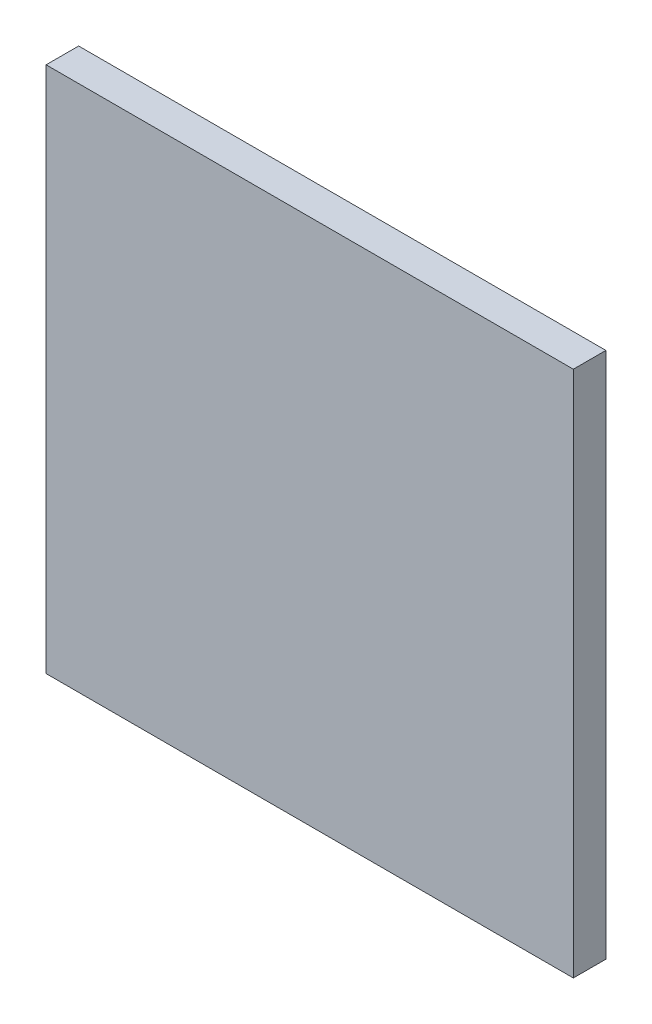
ISO-10303-21;
HEADER;
FILE_DESCRIPTION(('STEP AP214'),'2;1');
FILE_NAME('part.step','',(''),(''),'','','');
FILE_SCHEMA(('AUTOMOTIVE_DESIGN { 1 0 10303 214 1 1 1 1 }'));
ENDSEC;
DATA;
#1=APPLICATION_CONTEXT('core data for automotive mechanical design processes');
#2=APPLICATION_PROTOCOL_DEFINITION('international standard','automotive_design',2000,#1);
#3=PRODUCT_CONTEXT('',#1,'mechanical');
#4=PRODUCT('Part','Part','',(#3));
#5=PRODUCT_RELATED_PRODUCT_CATEGORY('part','',(#4));
#6=PRODUCT_DEFINITION_FORMATION('','',#4);
#7=PRODUCT_DEFINITION_CONTEXT('part definition',#1,'design');
#8=PRODUCT_DEFINITION('design','',#6,#7);
#9=PRODUCT_DEFINITION_SHAPE('','',#8);
#10=(LENGTH_UNIT() NAMED_UNIT(*) SI_UNIT(.MILLI.,.METRE.));
#11=(NAMED_UNIT(*) PLANE_ANGLE_UNIT() SI_UNIT($,.RADIAN.));
#12=(NAMED_UNIT(*) SI_UNIT($,.STERADIAN.) SOLID_ANGLE_UNIT());
#13=UNCERTAINTY_MEASURE_WITH_UNIT(LENGTH_MEASURE(1.E-05),#10,'distance_accuracy_value','');
#14=(GEOMETRIC_REPRESENTATION_CONTEXT(3) GLOBAL_UNCERTAINTY_ASSIGNED_CONTEXT((#13)) GLOBAL_UNIT_ASSIGNED_CONTEXT((#10,
#11,#12)) REPRESENTATION_CONTEXT('',''));
#15=CARTESIAN_POINT('',(0.,0.,0.));
#16=DIRECTION('',(0.,0.,1.));
#17=DIRECTION('',(1.,0.,0.));
#18=AXIS2_PLACEMENT_3D('',#15,#16,#17);
#19=CARTESIAN_POINT('',(0.,0.,1.00000000000006));
#20=DIRECTION('',(0.,0.,1.));
#21=DIRECTION('',(1.,0.,0.));
#22=AXIS2_PLACEMENT_3D('',#19,#20,#21);
#23=PLANE('',#22);
#24=DIRECTION('',(0.,1.,0.));
#25=VECTOR('',#24,1.);
#26=CARTESIAN_POINT('',(-8.10000000000062,8.10000000000062,1.00000000000006));
#27=LINE('',#26,#25);
#28=CARTESIAN_POINT('',(-8.10000000000062,-8.10000000000062,1.00000000000006));
#29=VERTEX_POINT('',#28);
#30=CARTESIAN_POINT('',(-8.10000000000062,8.10000000000062,1.00000000000006));
#31=VERTEX_POINT('',#30);
#32=EDGE_CURVE('E68',#29,#31,#27,.T.);
#33=ORIENTED_EDGE('',*,*,#32,.F.);
#34=DIRECTION('',(1.,0.,0.));
#35=VECTOR('',#34,1.);
#36=CARTESIAN_POINT('',(-8.10000000000062,-8.10000000000062,1.00000000000006));
#37=LINE('',#36,#35);
#38=CARTESIAN_POINT('',(8.10000000000062,-8.10000000000062,1.00000000000006));
#39=VERTEX_POINT('',#38);
#40=EDGE_CURVE('E20',#39,#29,#37,.F.);
#41=ORIENTED_EDGE('',*,*,#40,.F.);
#42=DIRECTION('',(0.,1.,0.));
#43=VECTOR('',#42,1.);
#44=CARTESIAN_POINT('',(8.10000000000062,-8.10000000000062,1.00000000000006));
#45=LINE('',#44,#43);
#46=CARTESIAN_POINT('',(8.10000000000062,8.10000000000062,1.00000000000006));
#47=VERTEX_POINT('',#46);
#48=EDGE_CURVE('E58',#47,#39,#45,.F.);
#49=ORIENTED_EDGE('',*,*,#48,.F.);
#50=DIRECTION('',(1.,0.,0.));
#51=VECTOR('',#50,1.);
#52=CARTESIAN_POINT('',(8.10000000000062,8.10000000000062,1.00000000000006));
#53=LINE('',#52,#51);
#54=EDGE_CURVE('E53',#31,#47,#53,.T.);
#55=ORIENTED_EDGE('',*,*,#54,.F.);
#56=EDGE_LOOP('',(#33,#41,#49,#55));
#57=FACE_BOUND('',#56,.T.);
#58=ADVANCED_FACE('F17',(#57),#23,.T.);
#59=CARTESIAN_POINT('',(-8.10000000000062,-8.10000000000062,0.));
#60=DIRECTION('',(0.,-1.,0.));
#61=DIRECTION('',(0.,0.,-1.));
#62=AXIS2_PLACEMENT_3D('',#59,#60,#61);
#63=PLANE('',#62);
#64=DIRECTION('',(0.,0.,1.));
#65=VECTOR('',#64,1.);
#66=CARTESIAN_POINT('',(-8.10000000000062,-8.10000000000062,0.));
#67=LINE('',#66,#65);
#68=CARTESIAN_POINT('',(-8.10000000000062,-8.10000000000062,0.));
#69=VERTEX_POINT('',#68);
#70=EDGE_CURVE('E79',#69,#29,#67,.T.);
#71=ORIENTED_EDGE('',*,*,#70,.F.);
#72=DIRECTION('',(1.,0.,0.));
#73=VECTOR('',#72,1.);
#74=CARTESIAN_POINT('',(0.,-8.10000000000062,0.));
#75=LINE('',#74,#73);
#76=CARTESIAN_POINT('',(8.10000000000062,-8.10000000000062,0.));
#77=VERTEX_POINT('',#76);
#78=EDGE_CURVE('E74',#69,#77,#75,.T.);
#79=ORIENTED_EDGE('',*,*,#78,.T.);
#80=DIRECTION('',(0.,0.,-1.));
#81=VECTOR('',#80,1.);
#82=CARTESIAN_POINT('',(8.10000000000062,-8.10000000000062,0.));
#83=LINE('',#82,#81);
#84=EDGE_CURVE('E63',#39,#77,#83,.T.);
#85=ORIENTED_EDGE('',*,*,#84,.F.);
#86=ORIENTED_EDGE('',*,*,#40,.T.);
#87=EDGE_LOOP('',(#71,#79,#85,#86));
#88=FACE_BOUND('',#87,.T.);
#89=ADVANCED_FACE('F73',(#88),#63,.T.);
#90=CARTESIAN_POINT('',(8.10000000000062,-8.10000000000062,0.));
#91=DIRECTION('',(1.,0.,0.));
#92=DIRECTION('',(0.,0.,-1.));
#93=AXIS2_PLACEMENT_3D('',#90,#91,#92);
#94=PLANE('',#93);
#95=ORIENTED_EDGE('',*,*,#84,.T.);
#96=DIRECTION('',(0.,1.,0.));
#97=VECTOR('',#96,1.);
#98=CARTESIAN_POINT('',(8.10000000000062,0.,0.));
#99=LINE('',#98,#97);
#100=CARTESIAN_POINT('',(8.10000000000062,8.10000000000062,0.));
#101=VERTEX_POINT('',#100);
#102=EDGE_CURVE('E84',#77,#101,#99,.T.);
#103=ORIENTED_EDGE('',*,*,#102,.T.);
#104=DIRECTION('',(0.,0.,1.));
#105=VECTOR('',#104,1.);
#106=CARTESIAN_POINT('',(8.10000000000062,8.10000000000062,0.));
#107=LINE('',#106,#105);
#108=EDGE_CURVE('E65',#47,#101,#107,.F.);
#109=ORIENTED_EDGE('',*,*,#108,.F.);
#110=ORIENTED_EDGE('',*,*,#48,.T.);
#111=EDGE_LOOP('',(#95,#103,#109,#110));
#112=FACE_BOUND('',#111,.T.);
#113=ADVANCED_FACE('F60',(#112),#94,.T.);
#114=CARTESIAN_POINT('',(8.10000000000062,8.10000000000062,0.));
#115=DIRECTION('',(0.,1.,0.));
#116=DIRECTION('',(0.,0.,1.));
#117=AXIS2_PLACEMENT_3D('',#114,#115,#116);
#118=PLANE('',#117);
#119=ORIENTED_EDGE('',*,*,#108,.T.);
#120=DIRECTION('',(1.,0.,0.));
#121=VECTOR('',#120,1.);
#122=CARTESIAN_POINT('',(0.,8.10000000000062,0.));
#123=LINE('',#122,#121);
#124=CARTESIAN_POINT('',(-8.10000000000062,8.10000000000062,0.));
#125=VERTEX_POINT('',#124);
#126=EDGE_CURVE('E26',#101,#125,#123,.F.);
#127=ORIENTED_EDGE('',*,*,#126,.T.);
#128=DIRECTION('',(0.,0.,1.));
#129=VECTOR('',#128,1.);
#130=CARTESIAN_POINT('',(-8.10000000000062,8.10000000000062,0.));
#131=LINE('',#130,#129);
#132=EDGE_CURVE('E34',#31,#125,#131,.F.);
#133=ORIENTED_EDGE('',*,*,#132,.F.);
#134=ORIENTED_EDGE('',*,*,#54,.T.);
#135=EDGE_LOOP('',(#119,#127,#133,#134));
#136=FACE_BOUND('',#135,.T.);
#137=ADVANCED_FACE('F88',(#136),#118,.T.);
#138=CARTESIAN_POINT('',(-8.10000000000062,8.10000000000062,0.));
#139=DIRECTION('',(-1.,0.,0.));
#140=DIRECTION('',(0.,0.,1.));
#141=AXIS2_PLACEMENT_3D('',#138,#139,#140);
#142=PLANE('',#141);
#143=ORIENTED_EDGE('',*,*,#132,.T.);
#144=DIRECTION('',(0.,1.,0.));
#145=VECTOR('',#144,1.);
#146=CARTESIAN_POINT('',(-8.10000000000062,0.,0.));
#147=LINE('',#146,#145);
#148=EDGE_CURVE('E11',#125,#69,#147,.F.);
#149=ORIENTED_EDGE('',*,*,#148,.T.);
#150=ORIENTED_EDGE('',*,*,#70,.T.);
#151=ORIENTED_EDGE('',*,*,#32,.T.);
#152=EDGE_LOOP('',(#143,#149,#150,#151));
#153=FACE_BOUND('',#152,.T.);
#154=ADVANCED_FACE('F91',(#153),#142,.T.);
#155=CARTESIAN_POINT('',(0.,0.,0.));
#156=DIRECTION('',(0.,0.,1.));
#157=DIRECTION('',(1.,0.,0.));
#158=AXIS2_PLACEMENT_3D('',#155,#156,#157);
#159=PLANE('',#158);
#160=ORIENTED_EDGE('',*,*,#126,.F.);
#161=ORIENTED_EDGE('',*,*,#102,.F.);
#162=ORIENTED_EDGE('',*,*,#78,.F.);
#163=ORIENTED_EDGE('',*,*,#148,.F.);
#164=EDGE_LOOP('',(#160,#161,#162,#163));
#165=FACE_BOUND('',#164,.T.);
#166=ADVANCED_FACE('F90',(#165),#159,.F.);
#167=CLOSED_SHELL('',(#58,#89,#113,#137,#154,#166));
#168=MANIFOLD_SOLID_BREP('B1',#167);
#169=ADVANCED_BREP_SHAPE_REPRESENTATION('',(#18,#168),#14);
#170=SHAPE_DEFINITION_REPRESENTATION(#9,#169);
ENDSEC;
END-ISO-10303-21;
